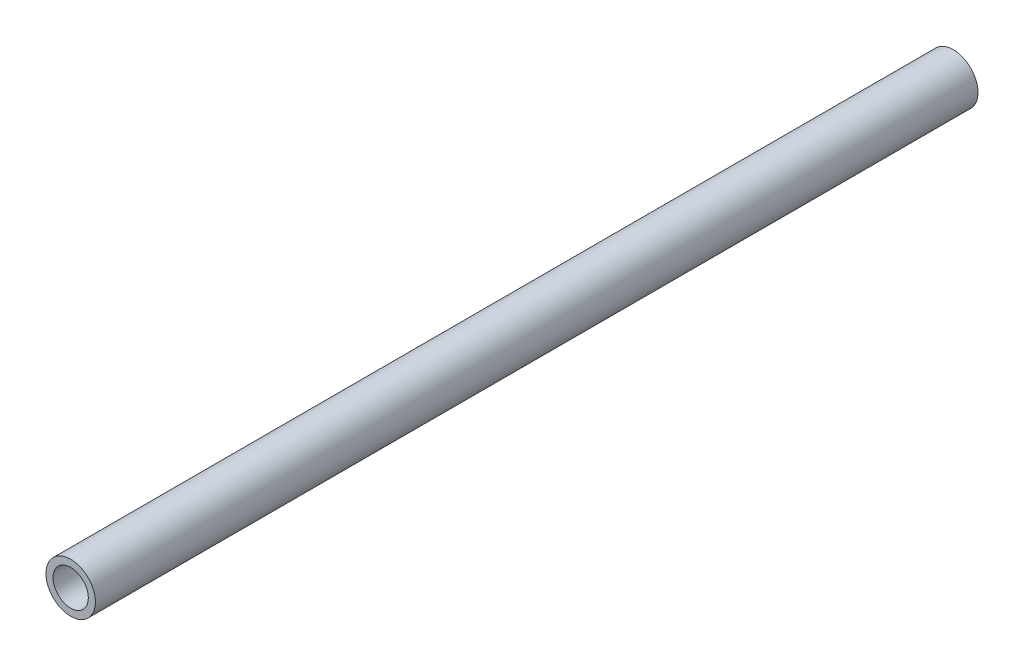
ISO-10303-21;
HEADER;
FILE_DESCRIPTION(('STEP AP214'),'2;1');
FILE_NAME('part.step','',(''),(''),'','','');
FILE_SCHEMA(('AUTOMOTIVE_DESIGN { 1 0 10303 214 1 1 1 1 }'));
ENDSEC;
DATA;
#1=APPLICATION_CONTEXT('core data for automotive mechanical design processes');
#2=APPLICATION_PROTOCOL_DEFINITION('international standard','automotive_design',2000,#1);
#3=PRODUCT_CONTEXT('',#1,'mechanical');
#4=PRODUCT('Part','Part','',(#3));
#5=PRODUCT_RELATED_PRODUCT_CATEGORY('part','',(#4));
#6=PRODUCT_DEFINITION_FORMATION('','',#4);
#7=PRODUCT_DEFINITION_CONTEXT('part definition',#1,'design');
#8=PRODUCT_DEFINITION('design','',#6,#7);
#9=PRODUCT_DEFINITION_SHAPE('','',#8);
#10=(LENGTH_UNIT() NAMED_UNIT(*) SI_UNIT(.MILLI.,.METRE.));
#11=(NAMED_UNIT(*) PLANE_ANGLE_UNIT() SI_UNIT($,.RADIAN.));
#12=(NAMED_UNIT(*) SI_UNIT($,.STERADIAN.) SOLID_ANGLE_UNIT());
#13=UNCERTAINTY_MEASURE_WITH_UNIT(LENGTH_MEASURE(1.E-05),#10,'distance_accuracy_value','');
#14=(GEOMETRIC_REPRESENTATION_CONTEXT(3) GLOBAL_UNCERTAINTY_ASSIGNED_CONTEXT((#13)) GLOBAL_UNIT_ASSIGNED_CONTEXT((#10,
#11,#12)) REPRESENTATION_CONTEXT('',''));
#15=CARTESIAN_POINT('',(0.,0.,0.));
#16=DIRECTION('',(0.,0.,1.));
#17=DIRECTION('',(1.,0.,0.));
#18=AXIS2_PLACEMENT_3D('',#15,#16,#17);
#19=CARTESIAN_POINT('',(0.,0.,250.));
#20=DIRECTION('',(0.,0.,1.));
#21=DIRECTION('',(1.,0.,0.));
#22=AXIS2_PLACEMENT_3D('',#19,#20,#21);
#23=PLANE('',#22);
#24=CARTESIAN_POINT('',(0.,0.,250.));
#25=DIRECTION('',(0.,0.,1.));
#26=DIRECTION('',(1.,0.,0.));
#27=AXIS2_PLACEMENT_3D('',#24,#25,#26);
#28=CIRCLE('',#27,7.);
#29=CARTESIAN_POINT('',(7.,0.,250.));
#30=VERTEX_POINT('',#29);
#31=EDGE_CURVE('E10',#30,#30,#28,.T.);
#32=ORIENTED_EDGE('',*,*,#31,.T.);
#33=EDGE_LOOP('',(#32));
#34=FACE_BOUND('',#33,.T.);
#35=CARTESIAN_POINT('',(0.,0.,250.));
#36=DIRECTION('',(0.,0.,1.));
#37=DIRECTION('',(1.,0.,0.));
#38=AXIS2_PLACEMENT_3D('',#35,#36,#37);
#39=CIRCLE('',#38,5.);
#40=CARTESIAN_POINT('',(5.,0.,250.));
#41=VERTEX_POINT('',#40);
#42=EDGE_CURVE('E43',#41,#41,#39,.T.);
#43=ORIENTED_EDGE('',*,*,#42,.F.);
#44=EDGE_LOOP('',(#43));
#45=FACE_BOUND('',#44,.T.);
#46=ADVANCED_FACE('F32',(#34,#45),#23,.T.);
#47=CARTESIAN_POINT('',(0.,0.,0.));
#48=DIRECTION('',(0.,0.,1.));
#49=DIRECTION('',(1.,0.,0.));
#50=AXIS2_PLACEMENT_3D('',#47,#48,#49);
#51=PLANE('',#50);
#52=CARTESIAN_POINT('',(0.,0.,0.));
#53=DIRECTION('',(0.,0.,1.));
#54=DIRECTION('',(1.,0.,0.));
#55=AXIS2_PLACEMENT_3D('',#52,#53,#54);
#56=CIRCLE('',#55,7.);
#57=CARTESIAN_POINT('',(7.,0.,0.));
#58=VERTEX_POINT('',#57);
#59=EDGE_CURVE('E36',#58,#58,#56,.T.);
#60=ORIENTED_EDGE('',*,*,#59,.F.);
#61=EDGE_LOOP('',(#60));
#62=FACE_BOUND('',#61,.T.);
#63=CARTESIAN_POINT('',(0.,0.,0.));
#64=DIRECTION('',(0.,0.,1.));
#65=DIRECTION('',(1.,0.,0.));
#66=AXIS2_PLACEMENT_3D('',#63,#64,#65);
#67=CIRCLE('',#66,5.);
#68=CARTESIAN_POINT('',(5.,0.,0.));
#69=VERTEX_POINT('',#68);
#70=EDGE_CURVE('E45',#69,#69,#67,.T.);
#71=ORIENTED_EDGE('',*,*,#70,.T.);
#72=EDGE_LOOP('',(#71));
#73=FACE_BOUND('',#72,.T.);
#74=ADVANCED_FACE('F55',(#62,#73),#51,.F.);
#75=CARTESIAN_POINT('',(0.,0.,250.));
#76=DIRECTION('',(0.,0.,-1.));
#77=DIRECTION('',(-1.,0.,0.));
#78=AXIS2_PLACEMENT_3D('',#75,#76,#77);
#79=CYLINDRICAL_SURFACE('',#78,7.);
#80=ORIENTED_EDGE('',*,*,#31,.F.);
#81=EDGE_LOOP('',(#80));
#82=FACE_BOUND('',#81,.T.);
#83=ORIENTED_EDGE('',*,*,#59,.T.);
#84=EDGE_LOOP('',(#83));
#85=FACE_BOUND('',#84,.T.);
#86=ADVANCED_FACE('F34',(#82,#85),#79,.T.);
#87=CARTESIAN_POINT('',(0.,0.,250.));
#88=DIRECTION('',(0.,0.,-1.));
#89=DIRECTION('',(-1.,0.,0.));
#90=AXIS2_PLACEMENT_3D('',#87,#88,#89);
#91=CYLINDRICAL_SURFACE('',#90,5.);
#92=ORIENTED_EDGE('',*,*,#42,.T.);
#93=EDGE_LOOP('',(#92));
#94=FACE_BOUND('',#93,.T.);
#95=ORIENTED_EDGE('',*,*,#70,.F.);
#96=EDGE_LOOP('',(#95));
#97=FACE_BOUND('',#96,.T.);
#98=ADVANCED_FACE('F51',(#94,#97),#91,.F.);
#99=CLOSED_SHELL('',(#46,#74,#86,#98));
#100=MANIFOLD_SOLID_BREP('B2',#99);
#101=ADVANCED_BREP_SHAPE_REPRESENTATION('',(#18,#100),#14);
#102=SHAPE_DEFINITION_REPRESENTATION(#9,#101);
ENDSEC;
END-ISO-10303-21;
